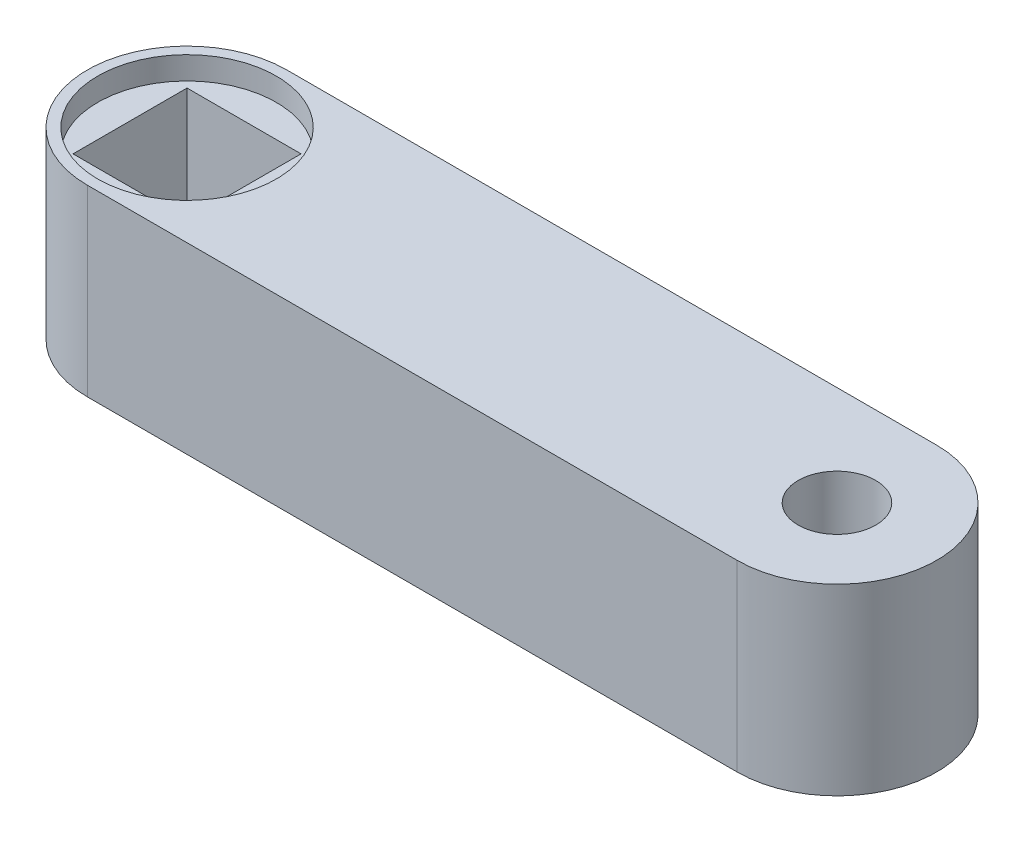
ISO-10303-21;
HEADER;
FILE_DESCRIPTION(('STEP AP214'),'2;1');
FILE_NAME('part.step','',(''),(''),'','','');
FILE_SCHEMA(('AUTOMOTIVE_DESIGN { 1 0 10303 214 1 1 1 1 }'));
ENDSEC;
DATA;
#1=APPLICATION_CONTEXT('core data for automotive mechanical design processes');
#2=APPLICATION_PROTOCOL_DEFINITION('international standard','automotive_design',2000,#1);
#3=PRODUCT_CONTEXT('',#1,'mechanical');
#4=PRODUCT('Part','Part','',(#3));
#5=PRODUCT_RELATED_PRODUCT_CATEGORY('part','',(#4));
#6=PRODUCT_DEFINITION_FORMATION('','',#4);
#7=PRODUCT_DEFINITION_CONTEXT('part definition',#1,'design');
#8=PRODUCT_DEFINITION('design','',#6,#7);
#9=PRODUCT_DEFINITION_SHAPE('','',#8);
#10=(LENGTH_UNIT() NAMED_UNIT(*) SI_UNIT(.MILLI.,.METRE.));
#11=(NAMED_UNIT(*) PLANE_ANGLE_UNIT() SI_UNIT($,.RADIAN.));
#12=(NAMED_UNIT(*) SI_UNIT($,.STERADIAN.) SOLID_ANGLE_UNIT());
#13=UNCERTAINTY_MEASURE_WITH_UNIT(LENGTH_MEASURE(1.E-05),#10,'distance_accuracy_value','');
#14=(GEOMETRIC_REPRESENTATION_CONTEXT(3) GLOBAL_UNCERTAINTY_ASSIGNED_CONTEXT((#13)) GLOBAL_UNIT_ASSIGNED_CONTEXT((#10,
#11,#12)) REPRESENTATION_CONTEXT('',''));
#15=CARTESIAN_POINT('',(0.,0.,0.));
#16=DIRECTION('',(0.,0.,1.));
#17=DIRECTION('',(1.,0.,0.));
#18=AXIS2_PLACEMENT_3D('',#15,#16,#17);
#19=CARTESIAN_POINT('',(3.175,0.,-3.175));
#20=DIRECTION('',(1.,0.,0.));
#21=DIRECTION('',(0.,0.,-1.));
#22=AXIS2_PLACEMENT_3D('',#19,#20,#21);
#23=PLANE('',#22);
#24=DIRECTION('',(0.,0.,-1.));
#25=VECTOR('',#24,1.);
#26=CARTESIAN_POINT('',(3.175,1.27,-3.175));
#27=LINE('',#26,#25);
#28=CARTESIAN_POINT('',(3.175,1.27,3.175));
#29=VERTEX_POINT('',#28);
#30=CARTESIAN_POINT('',(3.175,1.27,-3.175));
#31=VERTEX_POINT('',#30);
#32=EDGE_CURVE('E53',#29,#31,#27,.T.);
#33=ORIENTED_EDGE('',*,*,#32,.F.);
#34=DIRECTION('',(0.,1.,0.));
#35=VECTOR('',#34,1.);
#36=CARTESIAN_POINT('',(3.175,0.,3.175));
#37=LINE('',#36,#35);
#38=CARTESIAN_POINT('',(3.175,8.9408,3.175));
#39=VERTEX_POINT('',#38);
#40=EDGE_CURVE('E118',#29,#39,#37,.T.);
#41=ORIENTED_EDGE('',*,*,#40,.T.);
#42=DIRECTION('',(0.,0.,1.));
#43=VECTOR('',#42,1.);
#44=CARTESIAN_POINT('',(3.175,8.9408,-3.175));
#45=LINE('',#44,#43);
#46=CARTESIAN_POINT('',(3.175,8.9408,-3.175));
#47=VERTEX_POINT('',#46);
#48=EDGE_CURVE('E129',#47,#39,#45,.T.);
#49=ORIENTED_EDGE('',*,*,#48,.F.);
#50=DIRECTION('',(0.,1.,0.));
#51=VECTOR('',#50,1.);
#52=CARTESIAN_POINT('',(3.175,0.,-3.175));
#53=LINE('',#52,#51);
#54=EDGE_CURVE('E116',#31,#47,#53,.T.);
#55=ORIENTED_EDGE('',*,*,#54,.F.);
#56=EDGE_LOOP('',(#33,#41,#49,#55));
#57=FACE_BOUND('',#56,.T.);
#58=ADVANCED_FACE('F39',(#57),#23,.F.);
#59=CARTESIAN_POINT('',(-3.175,0.,3.175));
#60=DIRECTION('',(0.,0.,1.));
#61=DIRECTION('',(1.,0.,0.));
#62=AXIS2_PLACEMENT_3D('',#59,#60,#61);
#63=PLANE('',#62);
#64=DIRECTION('',(1.,0.,0.));
#65=VECTOR('',#64,1.);
#66=CARTESIAN_POINT('',(-3.175,1.27,3.175));
#67=LINE('',#66,#65);
#68=CARTESIAN_POINT('',(-3.175,1.27,3.175));
#69=VERTEX_POINT('',#68);
#70=EDGE_CURVE('E110',#69,#29,#67,.T.);
#71=ORIENTED_EDGE('',*,*,#70,.F.);
#72=DIRECTION('',(0.,1.,0.));
#73=VECTOR('',#72,1.);
#74=CARTESIAN_POINT('',(-3.175,0.,3.175));
#75=LINE('',#74,#73);
#76=CARTESIAN_POINT('',(-3.175,8.9408,3.175));
#77=VERTEX_POINT('',#76);
#78=EDGE_CURVE('E109',#69,#77,#75,.T.);
#79=ORIENTED_EDGE('',*,*,#78,.T.);
#80=DIRECTION('',(-1.,0.,0.));
#81=VECTOR('',#80,1.);
#82=CARTESIAN_POINT('',(-3.175,8.9408,3.175));
#83=LINE('',#82,#81);
#84=EDGE_CURVE('E168',#39,#77,#83,.T.);
#85=ORIENTED_EDGE('',*,*,#84,.F.);
#86=ORIENTED_EDGE('',*,*,#40,.F.);
#87=EDGE_LOOP('',(#71,#79,#85,#86));
#88=FACE_BOUND('',#87,.T.);
#89=ADVANCED_FACE('F202',(#88),#63,.F.);
#90=CARTESIAN_POINT('',(-3.175,0.,-3.175));
#91=DIRECTION('',(-1.,0.,0.));
#92=DIRECTION('',(0.,0.,1.));
#93=AXIS2_PLACEMENT_3D('',#90,#91,#92);
#94=PLANE('',#93);
#95=DIRECTION('',(0.,0.,1.));
#96=VECTOR('',#95,1.);
#97=CARTESIAN_POINT('',(-3.175,1.27,-3.175));
#98=LINE('',#97,#96);
#99=CARTESIAN_POINT('',(-3.175,1.27,-3.175));
#100=VERTEX_POINT('',#99);
#101=EDGE_CURVE('E103',#100,#69,#98,.T.);
#102=ORIENTED_EDGE('',*,*,#101,.F.);
#103=DIRECTION('',(0.,1.,0.));
#104=VECTOR('',#103,1.);
#105=CARTESIAN_POINT('',(-3.175,0.,-3.175));
#106=LINE('',#105,#104);
#107=CARTESIAN_POINT('',(-3.175,8.9408,-3.175));
#108=VERTEX_POINT('',#107);
#109=EDGE_CURVE('E61',#100,#108,#106,.T.);
#110=ORIENTED_EDGE('',*,*,#109,.T.);
#111=DIRECTION('',(0.,0.,-1.));
#112=VECTOR('',#111,1.);
#113=CARTESIAN_POINT('',(-3.175,8.9408,-3.175));
#114=LINE('',#113,#112);
#115=EDGE_CURVE('E165',#77,#108,#114,.T.);
#116=ORIENTED_EDGE('',*,*,#115,.F.);
#117=ORIENTED_EDGE('',*,*,#78,.F.);
#118=EDGE_LOOP('',(#102,#110,#116,#117));
#119=FACE_BOUND('',#118,.T.);
#120=ADVANCED_FACE('F108',(#119),#94,.F.);
#121=CARTESIAN_POINT('',(-3.175,0.,-3.175));
#122=DIRECTION('',(0.,0.,-1.));
#123=DIRECTION('',(-1.,0.,0.));
#124=AXIS2_PLACEMENT_3D('',#121,#122,#123);
#125=PLANE('',#124);
#126=DIRECTION('',(-1.,0.,0.));
#127=VECTOR('',#126,1.);
#128=CARTESIAN_POINT('',(-3.175,1.27,-3.175));
#129=LINE('',#128,#127);
#130=EDGE_CURVE('E11',#31,#100,#129,.T.);
#131=ORIENTED_EDGE('',*,*,#130,.F.);
#132=ORIENTED_EDGE('',*,*,#54,.T.);
#133=DIRECTION('',(1.,0.,0.));
#134=VECTOR('',#133,1.);
#135=CARTESIAN_POINT('',(-3.175,8.9408,-3.175));
#136=LINE('',#135,#134);
#137=EDGE_CURVE('E47',#108,#47,#136,.T.);
#138=ORIENTED_EDGE('',*,*,#137,.F.);
#139=ORIENTED_EDGE('',*,*,#109,.F.);
#140=EDGE_LOOP('',(#131,#132,#138,#139));
#141=FACE_BOUND('',#140,.T.);
#142=ADVANCED_FACE('F114',(#141),#125,.F.);
#143=CARTESIAN_POINT('',(0.,10.2108,0.));
#144=DIRECTION('',(0.,-1.,0.));
#145=DIRECTION('',(0.,0.,-1.));
#146=AXIS2_PLACEMENT_3D('',#143,#144,#145);
#147=CYLINDRICAL_SURFACE('',#146,5.55625);
#148=CARTESIAN_POINT('',(0.,0.,0.));
#149=DIRECTION('',(0.,1.,0.));
#150=DIRECTION('',(0.,0.,1.));
#151=AXIS2_PLACEMENT_3D('',#148,#149,#150);
#152=CIRCLE('',#151,5.55625);
#153=CARTESIAN_POINT('',(0.,0.,-5.55625));
#154=VERTEX_POINT('',#153);
#155=CARTESIAN_POINT('',(0.,0.,5.55625));
#156=VERTEX_POINT('',#155);
#157=EDGE_CURVE('E141',#154,#156,#152,.T.);
#158=ORIENTED_EDGE('',*,*,#157,.T.);
#159=DIRECTION('',(0.,-1.,0.));
#160=VECTOR('',#159,1.);
#161=CARTESIAN_POINT('',(0.,10.2108,5.55625));
#162=LINE('',#161,#160);
#163=CARTESIAN_POINT('',(0.,10.2108,5.55625));
#164=VERTEX_POINT('',#163);
#165=EDGE_CURVE('E157',#164,#156,#162,.T.);
#166=ORIENTED_EDGE('',*,*,#165,.F.);
#167=CARTESIAN_POINT('',(0.,10.2108,0.));
#168=DIRECTION('',(0.,1.,0.));
#169=DIRECTION('',(0.,0.,1.));
#170=AXIS2_PLACEMENT_3D('',#167,#168,#169);
#171=CIRCLE('',#170,5.55625);
#172=CARTESIAN_POINT('',(0.,10.2108,-5.55625));
#173=VERTEX_POINT('',#172);
#174=EDGE_CURVE('E130',#173,#164,#171,.T.);
#175=ORIENTED_EDGE('',*,*,#174,.F.);
#176=DIRECTION('',(0.,-1.,0.));
#177=VECTOR('',#176,1.);
#178=CARTESIAN_POINT('',(0.,10.2108,-5.55625));
#179=LINE('',#178,#177);
#180=EDGE_CURVE('E140',#173,#154,#179,.T.);
#181=ORIENTED_EDGE('',*,*,#180,.T.);
#182=EDGE_LOOP('',(#158,#166,#175,#181));
#183=FACE_BOUND('',#182,.T.);
#184=ADVANCED_FACE('F41',(#183),#147,.T.);
#185=CARTESIAN_POINT('',(0.,10.2108,5.55625));
#186=DIRECTION('',(0.,0.,-1.));
#187=DIRECTION('',(-1.,0.,0.));
#188=AXIS2_PLACEMENT_3D('',#185,#186,#187);
#189=PLANE('',#188);
#190=DIRECTION('',(1.,0.,0.));
#191=VECTOR('',#190,1.);
#192=CARTESIAN_POINT('',(0.,0.,5.55625));
#193=LINE('',#192,#191);
#194=CARTESIAN_POINT('',(36.195,0.,5.55625));
#195=VERTEX_POINT('',#194);
#196=EDGE_CURVE('E144',#156,#195,#193,.T.);
#197=ORIENTED_EDGE('',*,*,#196,.T.);
#198=DIRECTION('',(0.,-1.,0.));
#199=VECTOR('',#198,1.);
#200=CARTESIAN_POINT('',(36.195,10.2108,5.55625));
#201=LINE('',#200,#199);
#202=CARTESIAN_POINT('',(36.195,10.2108,5.55625));
#203=VERTEX_POINT('',#202);
#204=EDGE_CURVE('E154',#203,#195,#201,.T.);
#205=ORIENTED_EDGE('',*,*,#204,.F.);
#206=DIRECTION('',(1.,0.,0.));
#207=VECTOR('',#206,1.);
#208=CARTESIAN_POINT('',(0.,10.2108,5.55625));
#209=LINE('',#208,#207);
#210=EDGE_CURVE('E133',#164,#203,#209,.T.);
#211=ORIENTED_EDGE('',*,*,#210,.F.);
#212=ORIENTED_EDGE('',*,*,#165,.T.);
#213=EDGE_LOOP('',(#197,#205,#211,#212));
#214=FACE_BOUND('',#213,.T.);
#215=ADVANCED_FACE('F229',(#214),#189,.F.);
#216=CARTESIAN_POINT('',(36.195,10.2108,0.));
#217=DIRECTION('',(0.,-1.,0.));
#218=DIRECTION('',(0.,0.,-1.));
#219=AXIS2_PLACEMENT_3D('',#216,#217,#218);
#220=CYLINDRICAL_SURFACE('',#219,5.55625);
#221=CARTESIAN_POINT('',(36.195,0.,0.));
#222=DIRECTION('',(0.,1.,0.));
#223=DIRECTION('',(0.,0.,1.));
#224=AXIS2_PLACEMENT_3D('',#221,#222,#223);
#225=CIRCLE('',#224,5.55625);
#226=CARTESIAN_POINT('',(36.195,0.,-5.55625));
#227=VERTEX_POINT('',#226);
#228=EDGE_CURVE('E146',#195,#227,#225,.T.);
#229=ORIENTED_EDGE('',*,*,#228,.T.);
#230=DIRECTION('',(0.,-1.,0.));
#231=VECTOR('',#230,1.);
#232=CARTESIAN_POINT('',(36.195,10.2108,-5.55625));
#233=LINE('',#232,#231);
#234=CARTESIAN_POINT('',(36.195,10.2108,-5.55625));
#235=VERTEX_POINT('',#234);
#236=EDGE_CURVE('E151',#235,#227,#233,.T.);
#237=ORIENTED_EDGE('',*,*,#236,.F.);
#238=CARTESIAN_POINT('',(36.195,10.2108,0.));
#239=DIRECTION('',(0.,1.,0.));
#240=DIRECTION('',(0.,0.,1.));
#241=AXIS2_PLACEMENT_3D('',#238,#239,#240);
#242=CIRCLE('',#241,5.55625);
#243=EDGE_CURVE('E136',#203,#235,#242,.T.);
#244=ORIENTED_EDGE('',*,*,#243,.F.);
#245=ORIENTED_EDGE('',*,*,#204,.T.);
#246=EDGE_LOOP('',(#229,#237,#244,#245));
#247=FACE_BOUND('',#246,.T.);
#248=ADVANCED_FACE('F226',(#247),#220,.T.);
#249=CARTESIAN_POINT('',(0.,10.2108,-5.55625));
#250=DIRECTION('',(0.,0.,1.));
#251=DIRECTION('',(1.,0.,0.));
#252=AXIS2_PLACEMENT_3D('',#249,#250,#251);
#253=PLANE('',#252);
#254=DIRECTION('',(-1.,0.,0.));
#255=VECTOR('',#254,1.);
#256=CARTESIAN_POINT('',(0.,0.,-5.55625));
#257=LINE('',#256,#255);
#258=EDGE_CURVE('E134',#227,#154,#257,.T.);
#259=ORIENTED_EDGE('',*,*,#258,.T.);
#260=ORIENTED_EDGE('',*,*,#180,.F.);
#261=DIRECTION('',(-1.,0.,0.));
#262=VECTOR('',#261,1.);
#263=CARTESIAN_POINT('',(0.,10.2108,-5.55625));
#264=LINE('',#263,#262);
#265=EDGE_CURVE('E138',#235,#173,#264,.T.);
#266=ORIENTED_EDGE('',*,*,#265,.F.);
#267=ORIENTED_EDGE('',*,*,#236,.T.);
#268=EDGE_LOOP('',(#259,#260,#266,#267));
#269=FACE_BOUND('',#268,.T.);
#270=ADVANCED_FACE('F220',(#269),#253,.F.);
#271=CARTESIAN_POINT('',(0.,10.2108,0.));
#272=DIRECTION('',(0.,1.,0.));
#273=DIRECTION('',(0.,0.,1.));
#274=AXIS2_PLACEMENT_3D('',#271,#272,#273);
#275=PLANE('',#274);
#276=CARTESIAN_POINT('',(0.,10.2108,0.));
#277=DIRECTION('',(0.,1.,0.));
#278=DIRECTION('',(0.,0.,1.));
#279=AXIS2_PLACEMENT_3D('',#276,#277,#278);
#280=CIRCLE('',#279,4.97205);
#281=CARTESIAN_POINT('',(0.,10.2108,4.97205));
#282=VERTEX_POINT('',#281);
#283=EDGE_CURVE('E174',#282,#282,#280,.T.);
#284=ORIENTED_EDGE('',*,*,#283,.F.);
#285=EDGE_LOOP('',(#284));
#286=FACE_BOUND('',#285,.T.);
#287=CARTESIAN_POINT('',(36.195,10.2108,0.));
#288=DIRECTION('',(0.,1.,0.));
#289=DIRECTION('',(0.,0.,1.));
#290=AXIS2_PLACEMENT_3D('',#287,#288,#289);
#291=CIRCLE('',#290,2.159);
#292=CARTESIAN_POINT('',(36.195,10.2108,2.159));
#293=VERTEX_POINT('',#292);
#294=EDGE_CURVE('E120',#293,#293,#291,.T.);
#295=ORIENTED_EDGE('',*,*,#294,.F.);
#296=EDGE_LOOP('',(#295));
#297=FACE_BOUND('',#296,.T.);
#298=ORIENTED_EDGE('',*,*,#174,.T.);
#299=ORIENTED_EDGE('',*,*,#210,.T.);
#300=ORIENTED_EDGE('',*,*,#243,.T.);
#301=ORIENTED_EDGE('',*,*,#265,.T.);
#302=EDGE_LOOP('',(#298,#299,#300,#301));
#303=FACE_BOUND('',#302,.T.);
#304=ADVANCED_FACE('F217',(#286,#297,#303),#275,.T.);
#305=CARTESIAN_POINT('',(0.,0.,0.));
#306=DIRECTION('',(0.,1.,0.));
#307=DIRECTION('',(0.,0.,1.));
#308=AXIS2_PLACEMENT_3D('',#305,#306,#307);
#309=PLANE('',#308);
#310=CARTESIAN_POINT('',(0.,0.,0.));
#311=DIRECTION('',(0.,1.,0.));
#312=DIRECTION('',(0.,0.,1.));
#313=AXIS2_PLACEMENT_3D('',#310,#311,#312);
#314=CIRCLE('',#313,4.97205);
#315=CARTESIAN_POINT('',(0.,0.,4.97205));
#316=VERTEX_POINT('',#315);
#317=EDGE_CURVE('E181',#316,#316,#314,.T.);
#318=ORIENTED_EDGE('',*,*,#317,.T.);
#319=EDGE_LOOP('',(#318));
#320=FACE_BOUND('',#319,.T.);
#321=CARTESIAN_POINT('',(36.195,0.,0.));
#322=DIRECTION('',(0.,1.,0.));
#323=DIRECTION('',(0.,0.,1.));
#324=AXIS2_PLACEMENT_3D('',#321,#322,#323);
#325=CIRCLE('',#324,2.159);
#326=CARTESIAN_POINT('',(36.195,0.,2.159));
#327=VERTEX_POINT('',#326);
#328=EDGE_CURVE('E126',#327,#327,#325,.T.);
#329=ORIENTED_EDGE('',*,*,#328,.T.);
#330=EDGE_LOOP('',(#329));
#331=FACE_BOUND('',#330,.T.);
#332=ORIENTED_EDGE('',*,*,#157,.F.);
#333=ORIENTED_EDGE('',*,*,#258,.F.);
#334=ORIENTED_EDGE('',*,*,#228,.F.);
#335=ORIENTED_EDGE('',*,*,#196,.F.);
#336=EDGE_LOOP('',(#332,#333,#334,#335));
#337=FACE_BOUND('',#336,.T.);
#338=ADVANCED_FACE('F215',(#320,#331,#337),#309,.F.);
#339=CARTESIAN_POINT('',(36.195,0.,0.));
#340=DIRECTION('',(0.,1.,0.));
#341=DIRECTION('',(0.,0.,1.));
#342=AXIS2_PLACEMENT_3D('',#339,#340,#341);
#343=CYLINDRICAL_SURFACE('',#342,2.159);
#344=ORIENTED_EDGE('',*,*,#328,.F.);
#345=EDGE_LOOP('',(#344));
#346=FACE_BOUND('',#345,.T.);
#347=ORIENTED_EDGE('',*,*,#294,.T.);
#348=EDGE_LOOP('',(#347));
#349=FACE_BOUND('',#348,.T.);
#350=ADVANCED_FACE('F212',(#346,#349),#343,.F.);
#351=CARTESIAN_POINT('',(0.,8.9408,0.));
#352=DIRECTION('',(0.,1.,0.));
#353=DIRECTION('',(0.,0.,1.));
#354=AXIS2_PLACEMENT_3D('',#351,#352,#353);
#355=PLANE('',#354);
#356=CARTESIAN_POINT('',(0.,8.9408,0.));
#357=DIRECTION('',(0.,1.,0.));
#358=DIRECTION('',(0.,0.,1.));
#359=AXIS2_PLACEMENT_3D('',#356,#357,#358);
#360=CIRCLE('',#359,4.97205);
#361=CARTESIAN_POINT('',(0.,8.9408,4.97205));
#362=VERTEX_POINT('',#361);
#363=EDGE_CURVE('E173',#362,#362,#360,.T.);
#364=ORIENTED_EDGE('',*,*,#363,.T.);
#365=EDGE_LOOP('',(#364));
#366=FACE_BOUND('',#365,.T.);
#367=ORIENTED_EDGE('',*,*,#48,.T.);
#368=ORIENTED_EDGE('',*,*,#84,.T.);
#369=ORIENTED_EDGE('',*,*,#115,.T.);
#370=ORIENTED_EDGE('',*,*,#137,.T.);
#371=EDGE_LOOP('',(#367,#368,#369,#370));
#372=FACE_BOUND('',#371,.T.);
#373=ADVANCED_FACE('F162',(#366,#372),#355,.T.);
#374=CARTESIAN_POINT('',(0.,8.9408,0.));
#375=DIRECTION('',(0.,1.,0.));
#376=DIRECTION('',(0.,0.,1.));
#377=AXIS2_PLACEMENT_3D('',#374,#375,#376);
#378=CYLINDRICAL_SURFACE('',#377,4.97205);
#379=ORIENTED_EDGE('',*,*,#363,.F.);
#380=EDGE_LOOP('',(#379));
#381=FACE_BOUND('',#380,.T.);
#382=ORIENTED_EDGE('',*,*,#283,.T.);
#383=EDGE_LOOP('',(#382));
#384=FACE_BOUND('',#383,.T.);
#385=ADVANCED_FACE('F191',(#381,#384),#378,.F.);
#386=CARTESIAN_POINT('',(0.,1.27,0.));
#387=DIRECTION('',(0.,-1.,0.));
#388=DIRECTION('',(0.,0.,1.));
#389=AXIS2_PLACEMENT_3D('',#386,#387,#388);
#390=PLANE('',#389);
#391=CARTESIAN_POINT('',(0.,1.27,0.));
#392=DIRECTION('',(0.,1.,0.));
#393=DIRECTION('',(0.,0.,1.));
#394=AXIS2_PLACEMENT_3D('',#391,#392,#393);
#395=CIRCLE('',#394,4.97205);
#396=CARTESIAN_POINT('',(0.,1.27,4.97205));
#397=VERTEX_POINT('',#396);
#398=EDGE_CURVE('E111',#397,#397,#395,.T.);
#399=ORIENTED_EDGE('',*,*,#398,.F.);
#400=EDGE_LOOP('',(#399));
#401=FACE_BOUND('',#400,.T.);
#402=ORIENTED_EDGE('',*,*,#32,.T.);
#403=ORIENTED_EDGE('',*,*,#130,.T.);
#404=ORIENTED_EDGE('',*,*,#101,.T.);
#405=ORIENTED_EDGE('',*,*,#70,.T.);
#406=EDGE_LOOP('',(#402,#403,#404,#405));
#407=FACE_BOUND('',#406,.T.);
#408=ADVANCED_FACE('F102',(#401,#407),#390,.T.);
#409=CARTESIAN_POINT('',(0.,1.27,0.));
#410=DIRECTION('',(0.,-1.,0.));
#411=DIRECTION('',(0.,0.,-1.));
#412=AXIS2_PLACEMENT_3D('',#409,#410,#411);
#413=CYLINDRICAL_SURFACE('',#412,4.97205);
#414=ORIENTED_EDGE('',*,*,#398,.T.);
#415=EDGE_LOOP('',(#414));
#416=FACE_BOUND('',#415,.T.);
#417=ORIENTED_EDGE('',*,*,#317,.F.);
#418=EDGE_LOOP('',(#417));
#419=FACE_BOUND('',#418,.T.);
#420=ADVANCED_FACE('F187',(#416,#419),#413,.F.);
#421=CLOSED_SHELL('',(#58,#89,#120,#142,#184,#215,#248,#270,#304,#338,#350,#373,#385,#408,#420));
#422=MANIFOLD_SOLID_BREP('B2',#421);
#423=ADVANCED_BREP_SHAPE_REPRESENTATION('',(#18,#422),#14);
#424=SHAPE_DEFINITION_REPRESENTATION(#9,#423);
ENDSEC;
END-ISO-10303-21;
